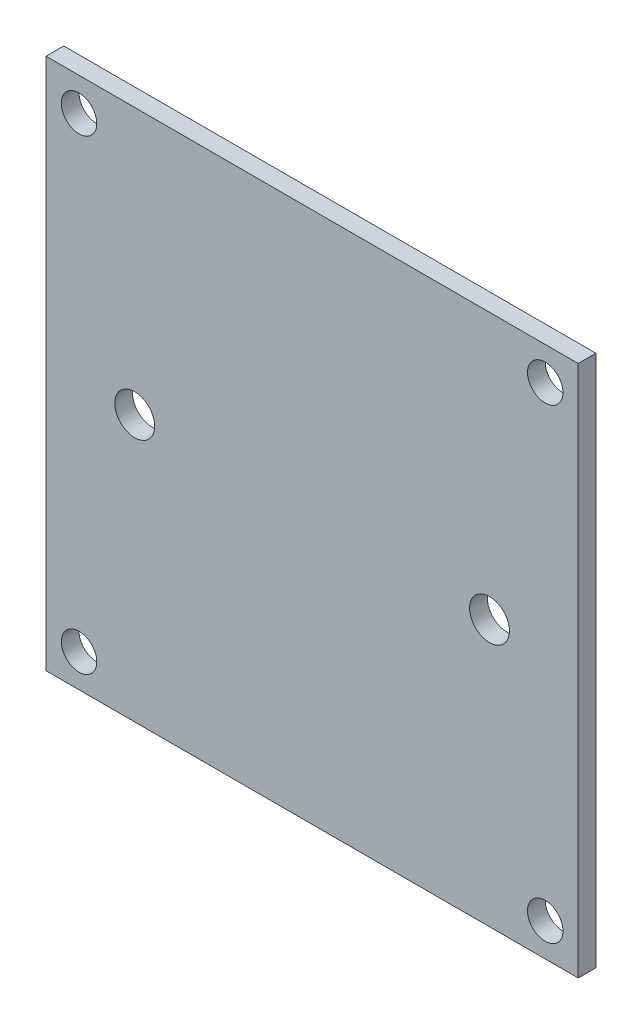
ISO-10303-21;
HEADER;
FILE_DESCRIPTION(('STEP AP214'),'2;1');
FILE_NAME('part.step','',(''),(''),'','','');
FILE_SCHEMA(('AUTOMOTIVE_DESIGN { 1 0 10303 214 1 1 1 1 }'));
ENDSEC;
DATA;
#1=APPLICATION_CONTEXT('core data for automotive mechanical design processes');
#2=APPLICATION_PROTOCOL_DEFINITION('international standard','automotive_design',2000,#1);
#3=PRODUCT_CONTEXT('',#1,'mechanical');
#4=PRODUCT('Part','Part','',(#3));
#5=PRODUCT_RELATED_PRODUCT_CATEGORY('part','',(#4));
#6=PRODUCT_DEFINITION_FORMATION('','',#4);
#7=PRODUCT_DEFINITION_CONTEXT('part definition',#1,'design');
#8=PRODUCT_DEFINITION('design','',#6,#7);
#9=PRODUCT_DEFINITION_SHAPE('','',#8);
#10=(LENGTH_UNIT() NAMED_UNIT(*) SI_UNIT(.MILLI.,.METRE.));
#11=(NAMED_UNIT(*) PLANE_ANGLE_UNIT() SI_UNIT($,.RADIAN.));
#12=(NAMED_UNIT(*) SI_UNIT($,.STERADIAN.) SOLID_ANGLE_UNIT());
#13=UNCERTAINTY_MEASURE_WITH_UNIT(LENGTH_MEASURE(1.E-05),#10,'distance_accuracy_value','');
#14=(GEOMETRIC_REPRESENTATION_CONTEXT(3) GLOBAL_UNCERTAINTY_ASSIGNED_CONTEXT((#13)) GLOBAL_UNIT_ASSIGNED_CONTEXT((#10,
#11,#12)) REPRESENTATION_CONTEXT('',''));
#15=CARTESIAN_POINT('',(0.,0.,0.));
#16=DIRECTION('',(0.,0.,1.));
#17=DIRECTION('',(1.,0.,0.));
#18=AXIS2_PLACEMENT_3D('',#15,#16,#17);
#19=CARTESIAN_POINT('',(-15.,15.,1.));
#20=DIRECTION('',(1.,0.,0.));
#21=DIRECTION('',(0.,1.,0.));
#22=AXIS2_PLACEMENT_3D('',#19,#20,#21);
#23=PLANE('',#22);
#24=DIRECTION('',(0.,-1.,0.));
#25=VECTOR('',#24,1.);
#26=CARTESIAN_POINT('',(-15.,15.,0.));
#27=LINE('',#26,#25);
#28=CARTESIAN_POINT('',(-15.,15.,0.));
#29=VERTEX_POINT('',#28);
#30=CARTESIAN_POINT('',(-15.,-15.,0.));
#31=VERTEX_POINT('',#30);
#32=EDGE_CURVE('E97',#29,#31,#27,.T.);
#33=ORIENTED_EDGE('',*,*,#32,.T.);
#34=DIRECTION('',(0.,0.,-1.));
#35=VECTOR('',#34,1.);
#36=CARTESIAN_POINT('',(-15.,-15.,1.));
#37=LINE('',#36,#35);
#38=CARTESIAN_POINT('',(-15.,-15.,1.));
#39=VERTEX_POINT('',#38);
#40=EDGE_CURVE('E11',#39,#31,#37,.T.);
#41=ORIENTED_EDGE('',*,*,#40,.F.);
#42=DIRECTION('',(0.,-1.,0.));
#43=VECTOR('',#42,1.);
#44=CARTESIAN_POINT('',(-15.,15.,1.));
#45=LINE('',#44,#43);
#46=CARTESIAN_POINT('',(-15.,15.,1.));
#47=VERTEX_POINT('',#46);
#48=EDGE_CURVE('E85',#47,#39,#45,.T.);
#49=ORIENTED_EDGE('',*,*,#48,.F.);
#50=DIRECTION('',(0.,0.,-1.));
#51=VECTOR('',#50,1.);
#52=CARTESIAN_POINT('',(-15.,15.,1.));
#53=LINE('',#52,#51);
#54=EDGE_CURVE('E93',#47,#29,#53,.T.);
#55=ORIENTED_EDGE('',*,*,#54,.T.);
#56=EDGE_LOOP('',(#33,#41,#49,#55));
#57=FACE_BOUND('',#56,.T.);
#58=ADVANCED_FACE('F34',(#57),#23,.F.);
#59=CARTESIAN_POINT('',(15.,-15.,1.));
#60=DIRECTION('',(0.,1.,0.));
#61=DIRECTION('',(-1.,0.,0.));
#62=AXIS2_PLACEMENT_3D('',#59,#60,#61);
#63=PLANE('',#62);
#64=DIRECTION('',(1.,0.,0.));
#65=VECTOR('',#64,1.);
#66=CARTESIAN_POINT('',(15.,-15.,0.));
#67=LINE('',#66,#65);
#68=CARTESIAN_POINT('',(15.,-15.,0.));
#69=VERTEX_POINT('',#68);
#70=EDGE_CURVE('E89',#31,#69,#67,.T.);
#71=ORIENTED_EDGE('',*,*,#70,.T.);
#72=DIRECTION('',(0.,0.,-1.));
#73=VECTOR('',#72,1.);
#74=CARTESIAN_POINT('',(15.,-15.,1.));
#75=LINE('',#74,#73);
#76=CARTESIAN_POINT('',(15.,-15.,1.));
#77=VERTEX_POINT('',#76);
#78=EDGE_CURVE('E42',#77,#69,#75,.T.);
#79=ORIENTED_EDGE('',*,*,#78,.F.);
#80=DIRECTION('',(1.,0.,0.));
#81=VECTOR('',#80,1.);
#82=CARTESIAN_POINT('',(15.,-15.,1.));
#83=LINE('',#82,#81);
#84=EDGE_CURVE('E80',#39,#77,#83,.T.);
#85=ORIENTED_EDGE('',*,*,#84,.F.);
#86=ORIENTED_EDGE('',*,*,#40,.T.);
#87=EDGE_LOOP('',(#71,#79,#85,#86));
#88=FACE_BOUND('',#87,.T.);
#89=ADVANCED_FACE('F88',(#88),#63,.F.);
#90=CARTESIAN_POINT('',(15.,15.,1.));
#91=DIRECTION('',(-1.,0.,0.));
#92=DIRECTION('',(0.,-1.,0.));
#93=AXIS2_PLACEMENT_3D('',#90,#91,#92);
#94=PLANE('',#93);
#95=DIRECTION('',(0.,1.,0.));
#96=VECTOR('',#95,1.);
#97=CARTESIAN_POINT('',(15.,15.,0.));
#98=LINE('',#97,#96);
#99=CARTESIAN_POINT('',(15.,15.,0.));
#100=VERTEX_POINT('',#99);
#101=EDGE_CURVE('E67',#69,#100,#98,.T.);
#102=ORIENTED_EDGE('',*,*,#101,.T.);
#103=DIRECTION('',(0.,0.,-1.));
#104=VECTOR('',#103,1.);
#105=CARTESIAN_POINT('',(15.,15.,1.));
#106=LINE('',#105,#104);
#107=CARTESIAN_POINT('',(15.,15.,1.));
#108=VERTEX_POINT('',#107);
#109=EDGE_CURVE('E90',#108,#100,#106,.T.);
#110=ORIENTED_EDGE('',*,*,#109,.F.);
#111=DIRECTION('',(0.,1.,0.));
#112=VECTOR('',#111,1.);
#113=CARTESIAN_POINT('',(15.,15.,1.));
#114=LINE('',#113,#112);
#115=EDGE_CURVE('E83',#77,#108,#114,.T.);
#116=ORIENTED_EDGE('',*,*,#115,.F.);
#117=ORIENTED_EDGE('',*,*,#78,.T.);
#118=EDGE_LOOP('',(#102,#110,#116,#117));
#119=FACE_BOUND('',#118,.T.);
#120=ADVANCED_FACE('F91',(#119),#94,.F.);
#121=CARTESIAN_POINT('',(15.,15.,1.));
#122=DIRECTION('',(0.,-1.,0.));
#123=DIRECTION('',(1.,0.,0.));
#124=AXIS2_PLACEMENT_3D('',#121,#122,#123);
#125=PLANE('',#124);
#126=DIRECTION('',(-1.,0.,0.));
#127=VECTOR('',#126,1.);
#128=CARTESIAN_POINT('',(15.,15.,0.));
#129=LINE('',#128,#127);
#130=EDGE_CURVE('E73',#100,#29,#129,.T.);
#131=ORIENTED_EDGE('',*,*,#130,.T.);
#132=ORIENTED_EDGE('',*,*,#54,.F.);
#133=DIRECTION('',(-1.,0.,0.));
#134=VECTOR('',#133,1.);
#135=CARTESIAN_POINT('',(15.,15.,1.));
#136=LINE('',#135,#134);
#137=EDGE_CURVE('E50',#108,#47,#136,.T.);
#138=ORIENTED_EDGE('',*,*,#137,.F.);
#139=ORIENTED_EDGE('',*,*,#109,.T.);
#140=EDGE_LOOP('',(#131,#132,#138,#139));
#141=FACE_BOUND('',#140,.T.);
#142=ADVANCED_FACE('F105',(#141),#125,.F.);
#143=CARTESIAN_POINT('',(0.,0.,1.));
#144=DIRECTION('',(0.,0.,-1.));
#145=DIRECTION('',(-1.,0.,0.));
#146=AXIS2_PLACEMENT_3D('',#143,#144,#145);
#147=PLANE('',#146);
#148=CARTESIAN_POINT('',(13.14,13.14,1.));
#149=DIRECTION('',(0.,0.,1.));
#150=DIRECTION('',(1.,0.,0.));
#151=AXIS2_PLACEMENT_3D('',#148,#149,#150);
#152=CIRCLE('',#151,1.);
#153=CARTESIAN_POINT('',(14.14,13.14,1.));
#154=VERTEX_POINT('',#153);
#155=EDGE_CURVE('E136',#154,#154,#152,.T.);
#156=ORIENTED_EDGE('',*,*,#155,.F.);
#157=EDGE_LOOP('',(#156));
#158=FACE_BOUND('',#157,.T.);
#159=CARTESIAN_POINT('',(13.14,-13.14,1.));
#160=DIRECTION('',(0.,0.,1.));
#161=DIRECTION('',(1.,0.,0.));
#162=AXIS2_PLACEMENT_3D('',#159,#160,#161);
#163=CIRCLE('',#162,0.999999999999999);
#164=CARTESIAN_POINT('',(14.14,-13.14,1.));
#165=VERTEX_POINT('',#164);
#166=EDGE_CURVE('E130',#165,#165,#163,.T.);
#167=ORIENTED_EDGE('',*,*,#166,.F.);
#168=EDGE_LOOP('',(#167));
#169=FACE_BOUND('',#168,.T.);
#170=CARTESIAN_POINT('',(-13.14,-13.14,1.));
#171=DIRECTION('',(0.,0.,1.));
#172=DIRECTION('',(1.,0.,0.));
#173=AXIS2_PLACEMENT_3D('',#170,#171,#172);
#174=CIRCLE('',#173,1.);
#175=CARTESIAN_POINT('',(-12.14,-13.14,1.));
#176=VERTEX_POINT('',#175);
#177=EDGE_CURVE('E124',#176,#176,#174,.T.);
#178=ORIENTED_EDGE('',*,*,#177,.F.);
#179=EDGE_LOOP('',(#178));
#180=FACE_BOUND('',#179,.T.);
#181=CARTESIAN_POINT('',(10.,0.,1.));
#182=DIRECTION('',(0.,0.,1.));
#183=DIRECTION('',(1.,0.,0.));
#184=AXIS2_PLACEMENT_3D('',#181,#182,#183);
#185=CIRCLE('',#184,1.125);
#186=CARTESIAN_POINT('',(11.125,0.,1.));
#187=VERTEX_POINT('',#186);
#188=EDGE_CURVE('E117',#187,#187,#185,.T.);
#189=ORIENTED_EDGE('',*,*,#188,.F.);
#190=EDGE_LOOP('',(#189));
#191=FACE_BOUND('',#190,.T.);
#192=CARTESIAN_POINT('',(-10.,0.,1.));
#193=DIRECTION('',(0.,0.,1.));
#194=DIRECTION('',(1.,0.,0.));
#195=AXIS2_PLACEMENT_3D('',#192,#193,#194);
#196=CIRCLE('',#195,1.125);
#197=CARTESIAN_POINT('',(-8.875,0.,1.));
#198=VERTEX_POINT('',#197);
#199=EDGE_CURVE('E141',#198,#198,#196,.T.);
#200=ORIENTED_EDGE('',*,*,#199,.F.);
#201=EDGE_LOOP('',(#200));
#202=FACE_BOUND('',#201,.T.);
#203=CARTESIAN_POINT('',(-13.14,13.14,1.));
#204=DIRECTION('',(0.,0.,1.));
#205=DIRECTION('',(1.,0.,0.));
#206=AXIS2_PLACEMENT_3D('',#203,#204,#205);
#207=CIRCLE('',#206,1.);
#208=CARTESIAN_POINT('',(-12.14,13.14,1.));
#209=VERTEX_POINT('',#208);
#210=EDGE_CURVE('E111',#209,#209,#207,.T.);
#211=ORIENTED_EDGE('',*,*,#210,.F.);
#212=EDGE_LOOP('',(#211));
#213=FACE_BOUND('',#212,.T.);
#214=ORIENTED_EDGE('',*,*,#48,.T.);
#215=ORIENTED_EDGE('',*,*,#84,.T.);
#216=ORIENTED_EDGE('',*,*,#115,.T.);
#217=ORIENTED_EDGE('',*,*,#137,.T.);
#218=EDGE_LOOP('',(#214,#215,#216,#217));
#219=FACE_BOUND('',#218,.T.);
#220=ADVANCED_FACE('F81',(#158,#169,#180,#191,#202,#213,#219),#147,.F.);
#221=CARTESIAN_POINT('',(0.,0.,0.));
#222=DIRECTION('',(0.,0.,-1.));
#223=DIRECTION('',(-1.,0.,0.));
#224=AXIS2_PLACEMENT_3D('',#221,#222,#223);
#225=PLANE('',#224);
#226=CARTESIAN_POINT('',(13.14,13.14,0.));
#227=DIRECTION('',(0.,0.,1.));
#228=DIRECTION('',(1.,0.,0.));
#229=AXIS2_PLACEMENT_3D('',#226,#227,#228);
#230=CIRCLE('',#229,1.);
#231=CARTESIAN_POINT('',(14.14,13.14,0.));
#232=VERTEX_POINT('',#231);
#233=EDGE_CURVE('E114',#232,#232,#230,.T.);
#234=ORIENTED_EDGE('',*,*,#233,.T.);
#235=EDGE_LOOP('',(#234));
#236=FACE_BOUND('',#235,.T.);
#237=CARTESIAN_POINT('',(13.14,-13.14,0.));
#238=DIRECTION('',(0.,0.,1.));
#239=DIRECTION('',(1.,0.,0.));
#240=AXIS2_PLACEMENT_3D('',#237,#238,#239);
#241=CIRCLE('',#240,0.999999999999999);
#242=CARTESIAN_POINT('',(14.14,-13.14,0.));
#243=VERTEX_POINT('',#242);
#244=EDGE_CURVE('E133',#243,#243,#241,.T.);
#245=ORIENTED_EDGE('',*,*,#244,.T.);
#246=EDGE_LOOP('',(#245));
#247=FACE_BOUND('',#246,.T.);
#248=CARTESIAN_POINT('',(-13.14,-13.14,0.));
#249=DIRECTION('',(0.,0.,1.));
#250=DIRECTION('',(1.,0.,0.));
#251=AXIS2_PLACEMENT_3D('',#248,#249,#250);
#252=CIRCLE('',#251,1.);
#253=CARTESIAN_POINT('',(-12.14,-13.14,0.));
#254=VERTEX_POINT('',#253);
#255=EDGE_CURVE('E127',#254,#254,#252,.T.);
#256=ORIENTED_EDGE('',*,*,#255,.T.);
#257=EDGE_LOOP('',(#256));
#258=FACE_BOUND('',#257,.T.);
#259=CARTESIAN_POINT('',(10.,0.,0.));
#260=DIRECTION('',(0.,0.,1.));
#261=DIRECTION('',(1.,0.,0.));
#262=AXIS2_PLACEMENT_3D('',#259,#260,#261);
#263=CIRCLE('',#262,1.125);
#264=CARTESIAN_POINT('',(11.125,0.,0.));
#265=VERTEX_POINT('',#264);
#266=EDGE_CURVE('E120',#265,#265,#263,.T.);
#267=ORIENTED_EDGE('',*,*,#266,.T.);
#268=EDGE_LOOP('',(#267));
#269=FACE_BOUND('',#268,.T.);
#270=CARTESIAN_POINT('',(-10.,0.,0.));
#271=DIRECTION('',(0.,0.,1.));
#272=DIRECTION('',(1.,0.,0.));
#273=AXIS2_PLACEMENT_3D('',#270,#271,#272);
#274=CIRCLE('',#273,1.125);
#275=CARTESIAN_POINT('',(-8.875,0.,0.));
#276=VERTEX_POINT('',#275);
#277=EDGE_CURVE('E121',#276,#276,#274,.T.);
#278=ORIENTED_EDGE('',*,*,#277,.T.);
#279=EDGE_LOOP('',(#278));
#280=FACE_BOUND('',#279,.T.);
#281=CARTESIAN_POINT('',(-13.14,13.14,0.));
#282=DIRECTION('',(0.,0.,1.));
#283=DIRECTION('',(1.,0.,0.));
#284=AXIS2_PLACEMENT_3D('',#281,#282,#283);
#285=CIRCLE('',#284,1.);
#286=CARTESIAN_POINT('',(-12.14,13.14,0.));
#287=VERTEX_POINT('',#286);
#288=EDGE_CURVE('E100',#287,#287,#285,.T.);
#289=ORIENTED_EDGE('',*,*,#288,.T.);
#290=EDGE_LOOP('',(#289));
#291=FACE_BOUND('',#290,.T.);
#292=ORIENTED_EDGE('',*,*,#32,.F.);
#293=ORIENTED_EDGE('',*,*,#130,.F.);
#294=ORIENTED_EDGE('',*,*,#101,.F.);
#295=ORIENTED_EDGE('',*,*,#70,.F.);
#296=EDGE_LOOP('',(#292,#293,#294,#295));
#297=FACE_BOUND('',#296,.T.);
#298=ADVANCED_FACE('F108',(#236,#247,#258,#269,#280,#291,#297),#225,.T.);
#299=CARTESIAN_POINT('',(-13.14,13.14,0.));
#300=DIRECTION('',(0.,0.,1.));
#301=DIRECTION('',(1.,0.,0.));
#302=AXIS2_PLACEMENT_3D('',#299,#300,#301);
#303=CYLINDRICAL_SURFACE('',#302,1.);
#304=ORIENTED_EDGE('',*,*,#288,.F.);
#305=EDGE_LOOP('',(#304));
#306=FACE_BOUND('',#305,.T.);
#307=ORIENTED_EDGE('',*,*,#210,.T.);
#308=EDGE_LOOP('',(#307));
#309=FACE_BOUND('',#308,.T.);
#310=ADVANCED_FACE('F153',(#306,#309),#303,.F.);
#311=CARTESIAN_POINT('',(-10.,0.,0.));
#312=DIRECTION('',(0.,0.,1.));
#313=DIRECTION('',(1.,0.,0.));
#314=AXIS2_PLACEMENT_3D('',#311,#312,#313);
#315=CYLINDRICAL_SURFACE('',#314,1.125);
#316=ORIENTED_EDGE('',*,*,#277,.F.);
#317=EDGE_LOOP('',(#316));
#318=FACE_BOUND('',#317,.T.);
#319=ORIENTED_EDGE('',*,*,#199,.T.);
#320=EDGE_LOOP('',(#319));
#321=FACE_BOUND('',#320,.T.);
#322=ADVANCED_FACE('F149',(#318,#321),#315,.F.);
#323=CARTESIAN_POINT('',(10.,0.,0.));
#324=DIRECTION('',(0.,0.,1.));
#325=DIRECTION('',(1.,0.,0.));
#326=AXIS2_PLACEMENT_3D('',#323,#324,#325);
#327=CYLINDRICAL_SURFACE('',#326,1.125);
#328=ORIENTED_EDGE('',*,*,#266,.F.);
#329=EDGE_LOOP('',(#328));
#330=FACE_BOUND('',#329,.T.);
#331=ORIENTED_EDGE('',*,*,#188,.T.);
#332=EDGE_LOOP('',(#331));
#333=FACE_BOUND('',#332,.T.);
#334=ADVANCED_FACE('F152',(#330,#333),#327,.F.);
#335=CARTESIAN_POINT('',(-13.14,-13.14,0.));
#336=DIRECTION('',(0.,0.,1.));
#337=DIRECTION('',(1.,0.,0.));
#338=AXIS2_PLACEMENT_3D('',#335,#336,#337);
#339=CYLINDRICAL_SURFACE('',#338,1.);
#340=ORIENTED_EDGE('',*,*,#255,.F.);
#341=EDGE_LOOP('',(#340));
#342=FACE_BOUND('',#341,.T.);
#343=ORIENTED_EDGE('',*,*,#177,.T.);
#344=EDGE_LOOP('',(#343));
#345=FACE_BOUND('',#344,.T.);
#346=ADVANCED_FACE('F214',(#342,#345),#339,.F.);
#347=CARTESIAN_POINT('',(13.14,-13.14,0.));
#348=DIRECTION('',(0.,0.,1.));
#349=DIRECTION('',(1.,0.,0.));
#350=AXIS2_PLACEMENT_3D('',#347,#348,#349);
#351=CYLINDRICAL_SURFACE('',#350,0.999999999999999);
#352=ORIENTED_EDGE('',*,*,#244,.F.);
#353=EDGE_LOOP('',(#352));
#354=FACE_BOUND('',#353,.T.);
#355=ORIENTED_EDGE('',*,*,#166,.T.);
#356=EDGE_LOOP('',(#355));
#357=FACE_BOUND('',#356,.T.);
#358=ADVANCED_FACE('F223',(#354,#357),#351,.F.);
#359=CARTESIAN_POINT('',(13.14,13.14,0.));
#360=DIRECTION('',(0.,0.,1.));
#361=DIRECTION('',(1.,0.,0.));
#362=AXIS2_PLACEMENT_3D('',#359,#360,#361);
#363=CYLINDRICAL_SURFACE('',#362,1.);
#364=ORIENTED_EDGE('',*,*,#233,.F.);
#365=EDGE_LOOP('',(#364));
#366=FACE_BOUND('',#365,.T.);
#367=ORIENTED_EDGE('',*,*,#155,.T.);
#368=EDGE_LOOP('',(#367));
#369=FACE_BOUND('',#368,.T.);
#370=ADVANCED_FACE('F233',(#366,#369),#363,.F.);
#371=CLOSED_SHELL('',(#58,#89,#120,#142,#220,#298,#310,#322,#334,#346,#358,#370));
#372=MANIFOLD_SOLID_BREP('B2',#371);
#373=ADVANCED_BREP_SHAPE_REPRESENTATION('',(#18,#372),#14);
#374=SHAPE_DEFINITION_REPRESENTATION(#9,#373);
ENDSEC;
END-ISO-10303-21;
